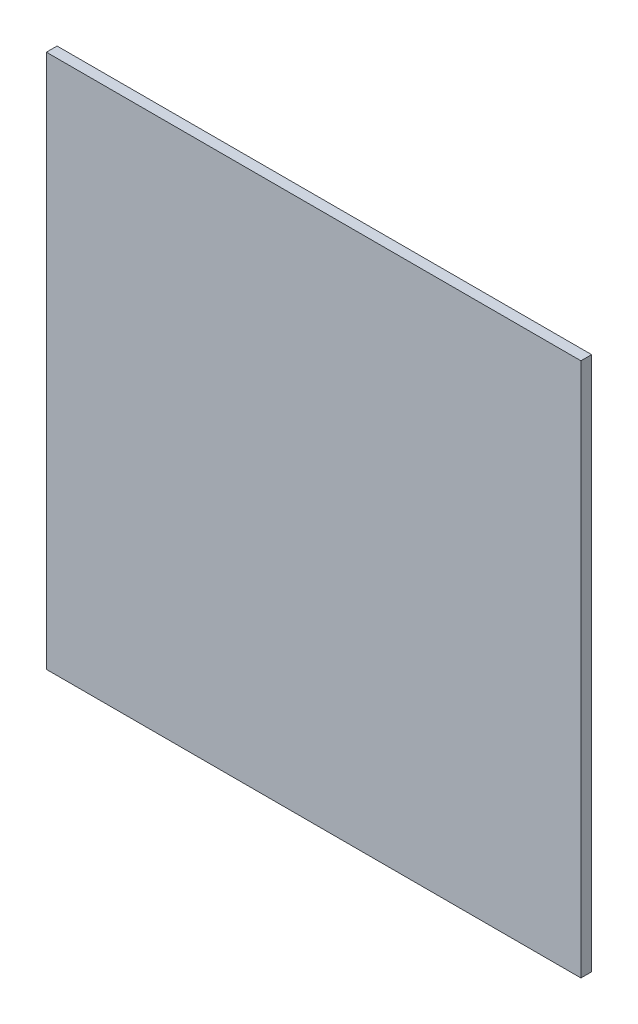
ISO-10303-21;
HEADER;
FILE_DESCRIPTION(('STEP AP214'),'2;1');
FILE_NAME('part.step','',(''),(''),'','','');
FILE_SCHEMA(('AUTOMOTIVE_DESIGN { 1 0 10303 214 1 1 1 1 }'));
ENDSEC;
DATA;
#1=APPLICATION_CONTEXT('core data for automotive mechanical design processes');
#2=APPLICATION_PROTOCOL_DEFINITION('international standard','automotive_design',2000,#1);
#3=PRODUCT_CONTEXT('',#1,'mechanical');
#4=PRODUCT('Part','Part','',(#3));
#5=PRODUCT_RELATED_PRODUCT_CATEGORY('part','',(#4));
#6=PRODUCT_DEFINITION_FORMATION('','',#4);
#7=PRODUCT_DEFINITION_CONTEXT('part definition',#1,'design');
#8=PRODUCT_DEFINITION('design','',#6,#7);
#9=PRODUCT_DEFINITION_SHAPE('','',#8);
#10=(LENGTH_UNIT() NAMED_UNIT(*) SI_UNIT(.MILLI.,.METRE.));
#11=(NAMED_UNIT(*) PLANE_ANGLE_UNIT() SI_UNIT($,.RADIAN.));
#12=(NAMED_UNIT(*) SI_UNIT($,.STERADIAN.) SOLID_ANGLE_UNIT());
#13=UNCERTAINTY_MEASURE_WITH_UNIT(LENGTH_MEASURE(1.E-05),#10,'distance_accuracy_value','');
#14=(GEOMETRIC_REPRESENTATION_CONTEXT(3) GLOBAL_UNCERTAINTY_ASSIGNED_CONTEXT((#13)) GLOBAL_UNIT_ASSIGNED_CONTEXT((#10,
#11,#12)) REPRESENTATION_CONTEXT('',''));
#15=CARTESIAN_POINT('',(0.,0.,0.));
#16=DIRECTION('',(0.,0.,1.));
#17=DIRECTION('',(1.,0.,0.));
#18=AXIS2_PLACEMENT_3D('',#15,#16,#17);
#19=CARTESIAN_POINT('',(-213.790215863038,371.495327102804,10.));
#20=DIRECTION('',(-1.,0.,0.));
#21=DIRECTION('',(0.,-1.,0.));
#22=AXIS2_PLACEMENT_3D('',#19,#20,#21);
#23=PLANE('',#22);
#24=DIRECTION('',(0.,1.,0.));
#25=VECTOR('',#24,1.);
#26=CARTESIAN_POINT('',(-213.790215863038,371.495327102804,0.));
#27=LINE('',#26,#25);
#28=CARTESIAN_POINT('',(-213.790215863038,-128.504672897196,0.));
#29=VERTEX_POINT('',#28);
#30=CARTESIAN_POINT('',(-213.790215863038,371.495327102804,0.));
#31=VERTEX_POINT('',#30);
#32=EDGE_CURVE('E96',#29,#31,#27,.T.);
#33=ORIENTED_EDGE('',*,*,#32,.T.);
#34=DIRECTION('',(0.,0.,-1.));
#35=VECTOR('',#34,1.);
#36=CARTESIAN_POINT('',(-213.790215863038,371.495327102804,10.));
#37=LINE('',#36,#35);
#38=CARTESIAN_POINT('',(-213.790215863038,371.495327102804,10.));
#39=VERTEX_POINT('',#38);
#40=EDGE_CURVE('E11',#39,#31,#37,.T.);
#41=ORIENTED_EDGE('',*,*,#40,.F.);
#42=DIRECTION('',(0.,1.,0.));
#43=VECTOR('',#42,1.);
#44=CARTESIAN_POINT('',(-213.790215863038,371.495327102804,10.));
#45=LINE('',#44,#43);
#46=CARTESIAN_POINT('',(-213.790215863038,-128.504672897196,10.));
#47=VERTEX_POINT('',#46);
#48=EDGE_CURVE('E84',#47,#39,#45,.T.);
#49=ORIENTED_EDGE('',*,*,#48,.F.);
#50=DIRECTION('',(0.,0.,-1.));
#51=VECTOR('',#50,1.);
#52=CARTESIAN_POINT('',(-213.790215863038,-128.504672897196,10.));
#53=LINE('',#52,#51);
#54=EDGE_CURVE('E92',#47,#29,#53,.T.);
#55=ORIENTED_EDGE('',*,*,#54,.T.);
#56=EDGE_LOOP('',(#33,#41,#49,#55));
#57=FACE_BOUND('',#56,.T.);
#58=ADVANCED_FACE('F33',(#57),#23,.F.);
#59=CARTESIAN_POINT('',(-713.790215863038,371.495327102804,10.));
#60=DIRECTION('',(0.,-1.,0.));
#61=DIRECTION('',(0.,0.,-1.));
#62=AXIS2_PLACEMENT_3D('',#59,#60,#61);
#63=PLANE('',#62);
#64=DIRECTION('',(-1.,0.,0.));
#65=VECTOR('',#64,1.);
#66=CARTESIAN_POINT('',(-713.790215863038,371.495327102804,0.));
#67=LINE('',#66,#65);
#68=CARTESIAN_POINT('',(-713.790215863038,371.495327102804,0.));
#69=VERTEX_POINT('',#68);
#70=EDGE_CURVE('E88',#31,#69,#67,.T.);
#71=ORIENTED_EDGE('',*,*,#70,.T.);
#72=DIRECTION('',(0.,0.,-1.));
#73=VECTOR('',#72,1.);
#74=CARTESIAN_POINT('',(-713.790215863038,371.495327102804,10.));
#75=LINE('',#74,#73);
#76=CARTESIAN_POINT('',(-713.790215863038,371.495327102804,10.));
#77=VERTEX_POINT('',#76);
#78=EDGE_CURVE('E41',#77,#69,#75,.T.);
#79=ORIENTED_EDGE('',*,*,#78,.F.);
#80=DIRECTION('',(-1.,0.,0.));
#81=VECTOR('',#80,1.);
#82=CARTESIAN_POINT('',(-713.790215863038,371.495327102804,10.));
#83=LINE('',#82,#81);
#84=EDGE_CURVE('E79',#39,#77,#83,.T.);
#85=ORIENTED_EDGE('',*,*,#84,.F.);
#86=ORIENTED_EDGE('',*,*,#40,.T.);
#87=EDGE_LOOP('',(#71,#79,#85,#86));
#88=FACE_BOUND('',#87,.T.);
#89=ADVANCED_FACE('F87',(#88),#63,.F.);
#90=CARTESIAN_POINT('',(-713.790215863038,371.495327102804,10.));
#91=DIRECTION('',(1.,0.,0.));
#92=DIRECTION('',(0.,0.,-1.));
#93=AXIS2_PLACEMENT_3D('',#90,#91,#92);
#94=PLANE('',#93);
#95=DIRECTION('',(0.,-1.,0.));
#96=VECTOR('',#95,1.);
#97=CARTESIAN_POINT('',(-713.790215863038,371.495327102804,0.));
#98=LINE('',#97,#96);
#99=CARTESIAN_POINT('',(-713.790215863038,-128.504672897196,0.));
#100=VERTEX_POINT('',#99);
#101=EDGE_CURVE('E66',#69,#100,#98,.T.);
#102=ORIENTED_EDGE('',*,*,#101,.T.);
#103=DIRECTION('',(0.,0.,-1.));
#104=VECTOR('',#103,1.);
#105=CARTESIAN_POINT('',(-713.790215863038,-128.504672897196,10.));
#106=LINE('',#105,#104);
#107=CARTESIAN_POINT('',(-713.790215863038,-128.504672897196,10.));
#108=VERTEX_POINT('',#107);
#109=EDGE_CURVE('E89',#108,#100,#106,.T.);
#110=ORIENTED_EDGE('',*,*,#109,.F.);
#111=DIRECTION('',(0.,-1.,0.));
#112=VECTOR('',#111,1.);
#113=CARTESIAN_POINT('',(-713.790215863038,371.495327102804,10.));
#114=LINE('',#113,#112);
#115=EDGE_CURVE('E82',#77,#108,#114,.T.);
#116=ORIENTED_EDGE('',*,*,#115,.F.);
#117=ORIENTED_EDGE('',*,*,#78,.T.);
#118=EDGE_LOOP('',(#102,#110,#116,#117));
#119=FACE_BOUND('',#118,.T.);
#120=ADVANCED_FACE('F90',(#119),#94,.F.);
#121=CARTESIAN_POINT('',(-713.790215863038,-128.504672897196,10.));
#122=DIRECTION('',(0.,1.,0.));
#123=DIRECTION('',(-1.,0.,0.));
#124=AXIS2_PLACEMENT_3D('',#121,#122,#123);
#125=PLANE('',#124);
#126=DIRECTION('',(1.,0.,0.));
#127=VECTOR('',#126,1.);
#128=CARTESIAN_POINT('',(-713.790215863038,-128.504672897196,0.));
#129=LINE('',#128,#127);
#130=EDGE_CURVE('E72',#100,#29,#129,.T.);
#131=ORIENTED_EDGE('',*,*,#130,.T.);
#132=ORIENTED_EDGE('',*,*,#54,.F.);
#133=DIRECTION('',(1.,0.,0.));
#134=VECTOR('',#133,1.);
#135=CARTESIAN_POINT('',(-713.790215863038,-128.504672897196,10.));
#136=LINE('',#135,#134);
#137=EDGE_CURVE('E49',#108,#47,#136,.T.);
#138=ORIENTED_EDGE('',*,*,#137,.F.);
#139=ORIENTED_EDGE('',*,*,#109,.T.);
#140=EDGE_LOOP('',(#131,#132,#138,#139));
#141=FACE_BOUND('',#140,.T.);
#142=ADVANCED_FACE('F103',(#141),#125,.F.);
#143=CARTESIAN_POINT('',(0.,0.,10.));
#144=DIRECTION('',(0.,0.,1.));
#145=DIRECTION('',(1.,0.,0.));
#146=AXIS2_PLACEMENT_3D('',#143,#144,#145);
#147=PLANE('',#146);
#148=ORIENTED_EDGE('',*,*,#48,.T.);
#149=ORIENTED_EDGE('',*,*,#84,.T.);
#150=ORIENTED_EDGE('',*,*,#115,.T.);
#151=ORIENTED_EDGE('',*,*,#137,.T.);
#152=EDGE_LOOP('',(#148,#149,#150,#151));
#153=FACE_BOUND('',#152,.T.);
#154=ADVANCED_FACE('F80',(#153),#147,.T.);
#155=CARTESIAN_POINT('',(0.,0.,0.));
#156=DIRECTION('',(0.,0.,1.));
#157=DIRECTION('',(1.,0.,0.));
#158=AXIS2_PLACEMENT_3D('',#155,#156,#157);
#159=PLANE('',#158);
#160=ORIENTED_EDGE('',*,*,#32,.F.);
#161=ORIENTED_EDGE('',*,*,#130,.F.);
#162=ORIENTED_EDGE('',*,*,#101,.F.);
#163=ORIENTED_EDGE('',*,*,#70,.F.);
#164=EDGE_LOOP('',(#160,#161,#162,#163));
#165=FACE_BOUND('',#164,.T.);
#166=ADVANCED_FACE('F106',(#165),#159,.F.);
#167=CLOSED_SHELL('',(#58,#89,#120,#142,#154,#166));
#168=MANIFOLD_SOLID_BREP('B2',#167);
#169=ADVANCED_BREP_SHAPE_REPRESENTATION('',(#18,#168),#14);
#170=SHAPE_DEFINITION_REPRESENTATION(#9,#169);
ENDSEC;
END-ISO-10303-21;
